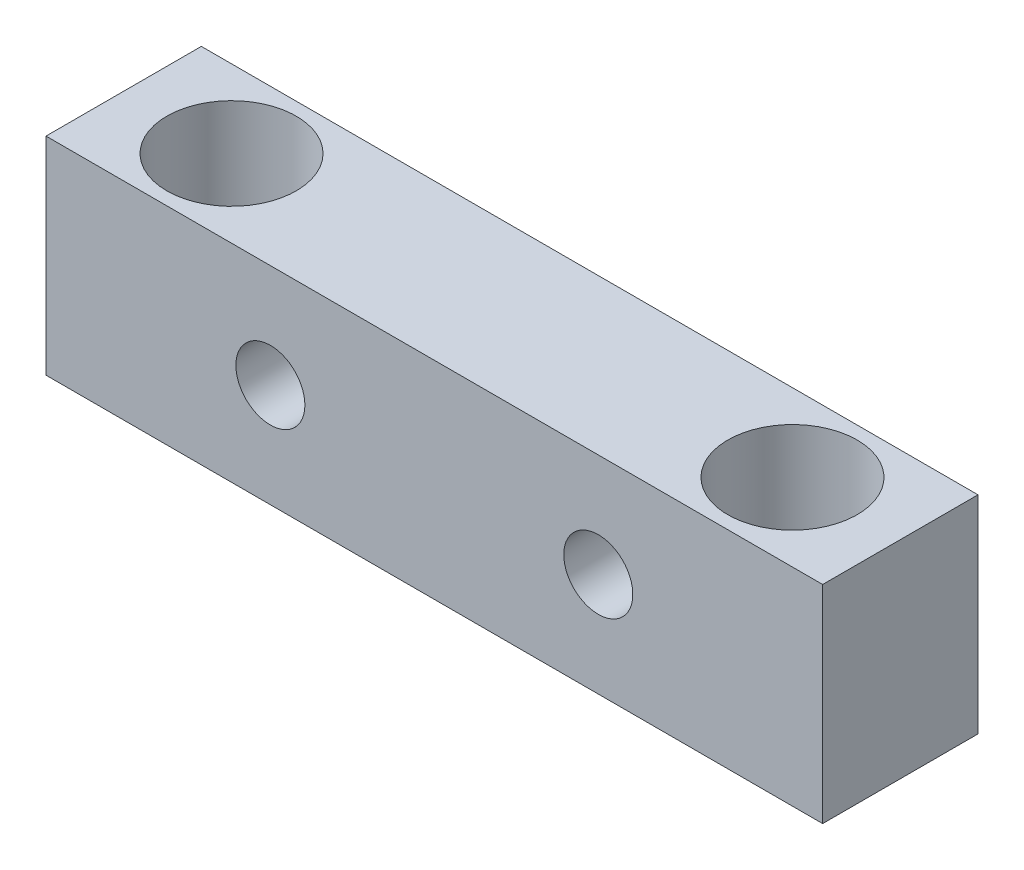
ISO-10303-21;
HEADER;
FILE_DESCRIPTION(('STEP AP214'),'2;1');
FILE_NAME('part.step','',(''),(''),'','','');
FILE_SCHEMA(('AUTOMOTIVE_DESIGN { 1 0 10303 214 1 1 1 1 }'));
ENDSEC;
DATA;
#1=APPLICATION_CONTEXT('core data for automotive mechanical design processes');
#2=APPLICATION_PROTOCOL_DEFINITION('international standard','automotive_design',2000,#1);
#3=PRODUCT_CONTEXT('',#1,'mechanical');
#4=PRODUCT('Part','Part','',(#3));
#5=PRODUCT_RELATED_PRODUCT_CATEGORY('part','',(#4));
#6=PRODUCT_DEFINITION_FORMATION('','',#4);
#7=PRODUCT_DEFINITION_CONTEXT('part definition',#1,'design');
#8=PRODUCT_DEFINITION('design','',#6,#7);
#9=PRODUCT_DEFINITION_SHAPE('','',#8);
#10=(LENGTH_UNIT() NAMED_UNIT(*) SI_UNIT(.MILLI.,.METRE.));
#11=(NAMED_UNIT(*) PLANE_ANGLE_UNIT() SI_UNIT($,.RADIAN.));
#12=(NAMED_UNIT(*) SI_UNIT($,.STERADIAN.) SOLID_ANGLE_UNIT());
#13=UNCERTAINTY_MEASURE_WITH_UNIT(LENGTH_MEASURE(1.E-05),#10,'distance_accuracy_value','');
#14=(GEOMETRIC_REPRESENTATION_CONTEXT(3) GLOBAL_UNCERTAINTY_ASSIGNED_CONTEXT((#13)) GLOBAL_UNIT_ASSIGNED_CONTEXT((#10,
#11,#12)) REPRESENTATION_CONTEXT('',''));
#15=CARTESIAN_POINT('',(0.,0.,0.));
#16=DIRECTION('',(0.,0.,1.));
#17=DIRECTION('',(1.,0.,0.));
#18=AXIS2_PLACEMENT_3D('',#15,#16,#17);
#19=CARTESIAN_POINT('',(0.,0.,18.));
#20=DIRECTION('',(0.,0.,-1.));
#21=DIRECTION('',(-1.,0.,0.));
#22=AXIS2_PLACEMENT_3D('',#19,#20,#21);
#23=PLANE('',#22);
#24=DIRECTION('',(0.,1.,0.));
#25=VECTOR('',#24,1.);
#26=CARTESIAN_POINT('',(45.,-12.,18.));
#27=LINE('',#26,#25);
#28=CARTESIAN_POINT('',(45.,-12.,18.));
#29=VERTEX_POINT('',#28);
#30=CARTESIAN_POINT('',(45.,12.,18.));
#31=VERTEX_POINT('',#30);
#32=EDGE_CURVE('E92',#29,#31,#27,.T.);
#33=ORIENTED_EDGE('',*,*,#32,.T.);
#34=DIRECTION('',(-1.,0.,0.));
#35=VECTOR('',#34,1.);
#36=CARTESIAN_POINT('',(-45.,12.,18.));
#37=LINE('',#36,#35);
#38=CARTESIAN_POINT('',(-45.,12.,18.));
#39=VERTEX_POINT('',#38);
#40=EDGE_CURVE('E87',#31,#39,#37,.T.);
#41=ORIENTED_EDGE('',*,*,#40,.T.);
#42=DIRECTION('',(0.,-1.,0.));
#43=VECTOR('',#42,1.);
#44=CARTESIAN_POINT('',(-45.,-12.,18.));
#45=LINE('',#44,#43);
#46=CARTESIAN_POINT('',(-45.,-12.,18.));
#47=VERTEX_POINT('',#46);
#48=EDGE_CURVE('E90',#39,#47,#45,.T.);
#49=ORIENTED_EDGE('',*,*,#48,.T.);
#50=DIRECTION('',(1.,0.,0.));
#51=VECTOR('',#50,1.);
#52=CARTESIAN_POINT('',(-45.,-12.,18.));
#53=LINE('',#52,#51);
#54=EDGE_CURVE('E57',#47,#29,#53,.T.);
#55=ORIENTED_EDGE('',*,*,#54,.T.);
#56=EDGE_LOOP('',(#33,#41,#49,#55));
#57=FACE_BOUND('',#56,.T.);
#58=CARTESIAN_POINT('',(-19.,0.,18.));
#59=DIRECTION('',(0.,0.,1.));
#60=DIRECTION('',(1.,0.,0.));
#61=AXIS2_PLACEMENT_3D('',#58,#59,#60);
#62=CIRCLE('',#61,4.);
#63=CARTESIAN_POINT('',(-15.,0.,18.));
#64=VERTEX_POINT('',#63);
#65=EDGE_CURVE('E112',#64,#64,#62,.T.);
#66=ORIENTED_EDGE('',*,*,#65,.F.);
#67=EDGE_LOOP('',(#66));
#68=FACE_BOUND('',#67,.T.);
#69=CARTESIAN_POINT('',(19.,0.,18.));
#70=DIRECTION('',(0.,0.,1.));
#71=DIRECTION('',(-1.,0.,0.));
#72=AXIS2_PLACEMENT_3D('',#69,#70,#71);
#73=CIRCLE('',#72,4.);
#74=CARTESIAN_POINT('',(15.,0.,18.));
#75=VERTEX_POINT('',#74);
#76=EDGE_CURVE('E134',#75,#75,#73,.T.);
#77=ORIENTED_EDGE('',*,*,#76,.F.);
#78=EDGE_LOOP('',(#77));
#79=FACE_BOUND('',#78,.T.);
#80=ADVANCED_FACE('F39',(#57,#68,#79),#23,.F.);
#81=CARTESIAN_POINT('',(0.,0.,0.));
#82=DIRECTION('',(0.,0.,-1.));
#83=DIRECTION('',(-1.,0.,0.));
#84=AXIS2_PLACEMENT_3D('',#81,#82,#83);
#85=PLANE('',#84);
#86=CARTESIAN_POINT('',(-19.,0.,0.));
#87=DIRECTION('',(0.,0.,1.));
#88=DIRECTION('',(1.,0.,0.));
#89=AXIS2_PLACEMENT_3D('',#86,#87,#88);
#90=CIRCLE('',#89,4.);
#91=CARTESIAN_POINT('',(-15.,0.,0.));
#92=VERTEX_POINT('',#91);
#93=EDGE_CURVE('E130',#92,#92,#90,.T.);
#94=ORIENTED_EDGE('',*,*,#93,.T.);
#95=EDGE_LOOP('',(#94));
#96=FACE_BOUND('',#95,.T.);
#97=DIRECTION('',(0.,1.,0.));
#98=VECTOR('',#97,1.);
#99=CARTESIAN_POINT('',(45.,-12.,0.));
#100=LINE('',#99,#98);
#101=CARTESIAN_POINT('',(45.,-12.,0.));
#102=VERTEX_POINT('',#101);
#103=CARTESIAN_POINT('',(45.,12.,0.));
#104=VERTEX_POINT('',#103);
#105=EDGE_CURVE('E108',#102,#104,#100,.T.);
#106=ORIENTED_EDGE('',*,*,#105,.F.);
#107=DIRECTION('',(1.,0.,0.));
#108=VECTOR('',#107,1.);
#109=CARTESIAN_POINT('',(-45.,-12.,0.));
#110=LINE('',#109,#108);
#111=CARTESIAN_POINT('',(-45.,-12.,0.));
#112=VERTEX_POINT('',#111);
#113=EDGE_CURVE('E80',#112,#102,#110,.T.);
#114=ORIENTED_EDGE('',*,*,#113,.F.);
#115=DIRECTION('',(0.,-1.,0.));
#116=VECTOR('',#115,1.);
#117=CARTESIAN_POINT('',(-45.,-12.,0.));
#118=LINE('',#117,#116);
#119=CARTESIAN_POINT('',(-45.,12.,0.));
#120=VERTEX_POINT('',#119);
#121=EDGE_CURVE('E74',#120,#112,#118,.T.);
#122=ORIENTED_EDGE('',*,*,#121,.F.);
#123=DIRECTION('',(-1.,0.,0.));
#124=VECTOR('',#123,1.);
#125=CARTESIAN_POINT('',(-45.,12.,0.));
#126=LINE('',#125,#124);
#127=EDGE_CURVE('E97',#104,#120,#126,.T.);
#128=ORIENTED_EDGE('',*,*,#127,.F.);
#129=EDGE_LOOP('',(#106,#114,#122,#128));
#130=FACE_BOUND('',#129,.T.);
#131=CARTESIAN_POINT('',(19.,0.,0.));
#132=DIRECTION('',(0.,0.,1.));
#133=DIRECTION('',(-1.,0.,0.));
#134=AXIS2_PLACEMENT_3D('',#131,#132,#133);
#135=CIRCLE('',#134,4.);
#136=CARTESIAN_POINT('',(15.,0.,0.));
#137=VERTEX_POINT('',#136);
#138=EDGE_CURVE('E138',#137,#137,#135,.T.);
#139=ORIENTED_EDGE('',*,*,#138,.T.);
#140=EDGE_LOOP('',(#139));
#141=FACE_BOUND('',#140,.T.);
#142=ADVANCED_FACE('F125',(#96,#130,#141),#85,.T.);
#143=CARTESIAN_POINT('',(45.,-12.,18.));
#144=DIRECTION('',(-1.,0.,0.));
#145=DIRECTION('',(0.,0.,1.));
#146=AXIS2_PLACEMENT_3D('',#143,#144,#145);
#147=PLANE('',#146);
#148=ORIENTED_EDGE('',*,*,#105,.T.);
#149=DIRECTION('',(0.,0.,-1.));
#150=VECTOR('',#149,1.);
#151=CARTESIAN_POINT('',(45.,12.,18.));
#152=LINE('',#151,#150);
#153=EDGE_CURVE('E11',#31,#104,#152,.T.);
#154=ORIENTED_EDGE('',*,*,#153,.F.);
#155=ORIENTED_EDGE('',*,*,#32,.F.);
#156=DIRECTION('',(0.,0.,-1.));
#157=VECTOR('',#156,1.);
#158=CARTESIAN_POINT('',(45.,-12.,18.));
#159=LINE('',#158,#157);
#160=EDGE_CURVE('E104',#29,#102,#159,.T.);
#161=ORIENTED_EDGE('',*,*,#160,.T.);
#162=EDGE_LOOP('',(#148,#154,#155,#161));
#163=FACE_BOUND('',#162,.T.);
#164=ADVANCED_FACE('F41',(#163),#147,.F.);
#165=CARTESIAN_POINT('',(-45.,12.,18.));
#166=DIRECTION('',(0.,-1.,0.));
#167=DIRECTION('',(1.,0.,0.));
#168=AXIS2_PLACEMENT_3D('',#165,#166,#167);
#169=PLANE('',#168);
#170=CARTESIAN_POINT('',(-32.5,12.,9.));
#171=DIRECTION('',(0.,1.,0.));
#172=DIRECTION('',(0.,0.,1.));
#173=AXIS2_PLACEMENT_3D('',#170,#171,#172);
#174=CIRCLE('',#173,7.5);
#175=CARTESIAN_POINT('',(-32.5,12.,16.5));
#176=VERTEX_POINT('',#175);
#177=EDGE_CURVE('E154',#176,#176,#174,.T.);
#178=ORIENTED_EDGE('',*,*,#177,.F.);
#179=EDGE_LOOP('',(#178));
#180=FACE_BOUND('',#179,.T.);
#181=CARTESIAN_POINT('',(32.5,12.,8.99999999999999));
#182=DIRECTION('',(0.,1.,0.));
#183=DIRECTION('',(0.,0.,-1.));
#184=AXIS2_PLACEMENT_3D('',#181,#182,#183);
#185=CIRCLE('',#184,7.5);
#186=CARTESIAN_POINT('',(32.5,12.,1.49999999999999));
#187=VERTEX_POINT('',#186);
#188=EDGE_CURVE('E146',#187,#187,#185,.T.);
#189=ORIENTED_EDGE('',*,*,#188,.F.);
#190=EDGE_LOOP('',(#189));
#191=FACE_BOUND('',#190,.T.);
#192=ORIENTED_EDGE('',*,*,#127,.T.);
#193=DIRECTION('',(0.,0.,-1.));
#194=VECTOR('',#193,1.);
#195=CARTESIAN_POINT('',(-45.,12.,18.));
#196=LINE('',#195,#194);
#197=EDGE_CURVE('E49',#39,#120,#196,.T.);
#198=ORIENTED_EDGE('',*,*,#197,.F.);
#199=ORIENTED_EDGE('',*,*,#40,.F.);
#200=ORIENTED_EDGE('',*,*,#153,.T.);
#201=EDGE_LOOP('',(#192,#198,#199,#200));
#202=FACE_BOUND('',#201,.T.);
#203=ADVANCED_FACE('F96',(#180,#191,#202),#169,.F.);
#204=CARTESIAN_POINT('',(-45.,-12.,18.));
#205=DIRECTION('',(1.,0.,0.));
#206=DIRECTION('',(0.,0.,-1.));
#207=AXIS2_PLACEMENT_3D('',#204,#205,#206);
#208=PLANE('',#207);
#209=ORIENTED_EDGE('',*,*,#121,.T.);
#210=DIRECTION('',(0.,0.,-1.));
#211=VECTOR('',#210,1.);
#212=CARTESIAN_POINT('',(-45.,-12.,18.));
#213=LINE('',#212,#211);
#214=EDGE_CURVE('E99',#47,#112,#213,.T.);
#215=ORIENTED_EDGE('',*,*,#214,.F.);
#216=ORIENTED_EDGE('',*,*,#48,.F.);
#217=ORIENTED_EDGE('',*,*,#197,.T.);
#218=EDGE_LOOP('',(#209,#215,#216,#217));
#219=FACE_BOUND('',#218,.T.);
#220=ADVANCED_FACE('F100',(#219),#208,.F.);
#221=CARTESIAN_POINT('',(-45.,-12.,18.));
#222=DIRECTION('',(0.,1.,0.));
#223=DIRECTION('',(0.,0.,1.));
#224=AXIS2_PLACEMENT_3D('',#221,#222,#223);
#225=PLANE('',#224);
#226=CARTESIAN_POINT('',(-32.5,-12.,9.));
#227=DIRECTION('',(0.,1.,0.));
#228=DIRECTION('',(0.,0.,1.));
#229=AXIS2_PLACEMENT_3D('',#226,#227,#228);
#230=CIRCLE('',#229,7.5);
#231=CARTESIAN_POINT('',(-32.5,-12.,16.5));
#232=VERTEX_POINT('',#231);
#233=EDGE_CURVE('E142',#232,#232,#230,.T.);
#234=ORIENTED_EDGE('',*,*,#233,.T.);
#235=EDGE_LOOP('',(#234));
#236=FACE_BOUND('',#235,.T.);
#237=CARTESIAN_POINT('',(32.5,-12.,8.99999999999999));
#238=DIRECTION('',(0.,1.,0.));
#239=DIRECTION('',(0.,0.,-1.));
#240=AXIS2_PLACEMENT_3D('',#237,#238,#239);
#241=CIRCLE('',#240,7.5);
#242=CARTESIAN_POINT('',(32.5,-12.,1.49999999999999));
#243=VERTEX_POINT('',#242);
#244=EDGE_CURVE('E150',#243,#243,#241,.T.);
#245=ORIENTED_EDGE('',*,*,#244,.T.);
#246=EDGE_LOOP('',(#245));
#247=FACE_BOUND('',#246,.T.);
#248=ORIENTED_EDGE('',*,*,#113,.T.);
#249=ORIENTED_EDGE('',*,*,#160,.F.);
#250=ORIENTED_EDGE('',*,*,#54,.F.);
#251=ORIENTED_EDGE('',*,*,#214,.T.);
#252=EDGE_LOOP('',(#248,#249,#250,#251));
#253=FACE_BOUND('',#252,.T.);
#254=ADVANCED_FACE('F122',(#236,#247,#253),#225,.F.);
#255=CARTESIAN_POINT('',(-19.,0.,18.));
#256=DIRECTION('',(0.,0.,-1.));
#257=DIRECTION('',(-1.,0.,0.));
#258=AXIS2_PLACEMENT_3D('',#255,#256,#257);
#259=CYLINDRICAL_SURFACE('',#258,4.);
#260=ORIENTED_EDGE('',*,*,#65,.T.);
#261=EDGE_LOOP('',(#260));
#262=FACE_BOUND('',#261,.T.);
#263=ORIENTED_EDGE('',*,*,#93,.F.);
#264=EDGE_LOOP('',(#263));
#265=FACE_BOUND('',#264,.T.);
#266=ADVANCED_FACE('F182',(#262,#265),#259,.F.);
#267=CARTESIAN_POINT('',(19.,0.,18.));
#268=DIRECTION('',(0.,0.,-1.));
#269=DIRECTION('',(-1.,0.,0.));
#270=AXIS2_PLACEMENT_3D('',#267,#268,#269);
#271=CYLINDRICAL_SURFACE('',#270,4.);
#272=ORIENTED_EDGE('',*,*,#76,.T.);
#273=EDGE_LOOP('',(#272));
#274=FACE_BOUND('',#273,.T.);
#275=ORIENTED_EDGE('',*,*,#138,.F.);
#276=EDGE_LOOP('',(#275));
#277=FACE_BOUND('',#276,.T.);
#278=ADVANCED_FACE('F176',(#274,#277),#271,.F.);
#279=CARTESIAN_POINT('',(32.5,-12.,8.99999999999999));
#280=DIRECTION('',(0.,1.,0.));
#281=DIRECTION('',(0.,0.,1.));
#282=AXIS2_PLACEMENT_3D('',#279,#280,#281);
#283=CYLINDRICAL_SURFACE('',#282,7.5);
#284=ORIENTED_EDGE('',*,*,#244,.F.);
#285=EDGE_LOOP('',(#284));
#286=FACE_BOUND('',#285,.T.);
#287=ORIENTED_EDGE('',*,*,#188,.T.);
#288=EDGE_LOOP('',(#287));
#289=FACE_BOUND('',#288,.T.);
#290=ADVANCED_FACE('F167',(#286,#289),#283,.F.);
#291=CARTESIAN_POINT('',(-32.5,-12.,9.));
#292=DIRECTION('',(0.,1.,0.));
#293=DIRECTION('',(0.,0.,1.));
#294=AXIS2_PLACEMENT_3D('',#291,#292,#293);
#295=CYLINDRICAL_SURFACE('',#294,7.5);
#296=ORIENTED_EDGE('',*,*,#233,.F.);
#297=EDGE_LOOP('',(#296));
#298=FACE_BOUND('',#297,.T.);
#299=ORIENTED_EDGE('',*,*,#177,.T.);
#300=EDGE_LOOP('',(#299));
#301=FACE_BOUND('',#300,.T.);
#302=ADVANCED_FACE('F164',(#298,#301),#295,.F.);
#303=CLOSED_SHELL('',(#80,#142,#164,#203,#220,#254,#266,#278,#290,#302));
#304=MANIFOLD_SOLID_BREP('B2',#303);
#305=ADVANCED_BREP_SHAPE_REPRESENTATION('',(#18,#304),#14);
#306=SHAPE_DEFINITION_REPRESENTATION(#9,#305);
ENDSEC;
END-ISO-10303-21;
